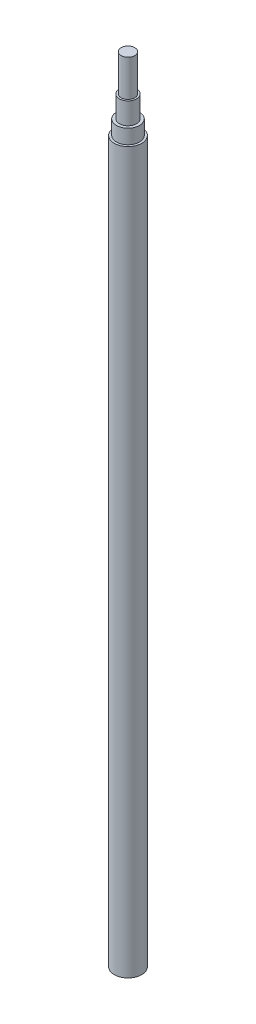
ISO-10303-21;
HEADER;
FILE_DESCRIPTION(('STEP AP214'),'2;1');
FILE_NAME('part.step','',(''),(''),'','','');
FILE_SCHEMA(('AUTOMOTIVE_DESIGN { 1 0 10303 214 1 1 1 1 }'));
ENDSEC;
DATA;
#1=APPLICATION_CONTEXT('core data for automotive mechanical design processes');
#2=APPLICATION_PROTOCOL_DEFINITION('international standard','automotive_design',2000,#1);
#3=PRODUCT_CONTEXT('',#1,'mechanical');
#4=PRODUCT('Part','Part','',(#3));
#5=PRODUCT_RELATED_PRODUCT_CATEGORY('part','',(#4));
#6=PRODUCT_DEFINITION_FORMATION('','',#4);
#7=PRODUCT_DEFINITION_CONTEXT('part definition',#1,'design');
#8=PRODUCT_DEFINITION('design','',#6,#7);
#9=PRODUCT_DEFINITION_SHAPE('','',#8);
#10=(LENGTH_UNIT() NAMED_UNIT(*) SI_UNIT(.MILLI.,.METRE.));
#11=(NAMED_UNIT(*) PLANE_ANGLE_UNIT() SI_UNIT($,.RADIAN.));
#12=(NAMED_UNIT(*) SI_UNIT($,.STERADIAN.) SOLID_ANGLE_UNIT());
#13=UNCERTAINTY_MEASURE_WITH_UNIT(LENGTH_MEASURE(1.E-05),#10,'distance_accuracy_value','');
#14=(GEOMETRIC_REPRESENTATION_CONTEXT(3) GLOBAL_UNCERTAINTY_ASSIGNED_CONTEXT((#13)) GLOBAL_UNIT_ASSIGNED_CONTEXT((#10,
#11,#12)) REPRESENTATION_CONTEXT('',''));
#15=CARTESIAN_POINT('',(0.,0.,0.));
#16=DIRECTION('',(0.,0.,1.));
#17=DIRECTION('',(1.,0.,0.));
#18=AXIS2_PLACEMENT_3D('',#15,#16,#17);
#19=CARTESIAN_POINT('',(0.,500.,0.));
#20=DIRECTION('',(0.,-1.,0.));
#21=DIRECTION('',(0.,0.,-1.));
#22=AXIS2_PLACEMENT_3D('',#19,#20,#21);
#23=CYLINDRICAL_SURFACE('',#22,9.52500000000001);
#24=CARTESIAN_POINT('',(0.,500.,0.));
#25=DIRECTION('',(0.,1.,0.));
#26=DIRECTION('',(0.,0.,1.));
#27=AXIS2_PLACEMENT_3D('',#24,#25,#26);
#28=CIRCLE('',#27,9.52500000000001);
#29=CARTESIAN_POINT('',(0.,500.,9.52500000000001));
#30=VERTEX_POINT('',#29);
#31=EDGE_CURVE('E62',#30,#30,#28,.T.);
#32=ORIENTED_EDGE('',*,*,#31,.F.);
#33=EDGE_LOOP('',(#32));
#34=FACE_BOUND('',#33,.T.);
#35=CARTESIAN_POINT('',(0.,0.,0.));
#36=DIRECTION('',(0.,1.,0.));
#37=DIRECTION('',(0.,0.,1.));
#38=AXIS2_PLACEMENT_3D('',#35,#36,#37);
#39=CIRCLE('',#38,9.52500000000001);
#40=CARTESIAN_POINT('',(0.,0.,9.52500000000001));
#41=VERTEX_POINT('',#40);
#42=EDGE_CURVE('E41',#41,#41,#39,.T.);
#43=ORIENTED_EDGE('',*,*,#42,.T.);
#44=EDGE_LOOP('',(#43));
#45=FACE_BOUND('',#44,.T.);
#46=ADVANCED_FACE('F38',(#34,#45),#23,.T.);
#47=CARTESIAN_POINT('',(0.,500.,0.));
#48=DIRECTION('',(0.,1.,0.));
#49=DIRECTION('',(0.,0.,1.));
#50=AXIS2_PLACEMENT_3D('',#47,#48,#49);
#51=PLANE('',#50);
#52=CARTESIAN_POINT('',(0.,500.,0.));
#53=DIRECTION('',(0.,1.,0.));
#54=DIRECTION('',(0.,0.,1.));
#55=AXIS2_PLACEMENT_3D('',#52,#53,#54);
#56=CIRCLE('',#55,8.);
#57=CARTESIAN_POINT('',(0.,500.,8.));
#58=VERTEX_POINT('',#57);
#59=EDGE_CURVE('E50',#58,#58,#56,.T.);
#60=ORIENTED_EDGE('',*,*,#59,.F.);
#61=EDGE_LOOP('',(#60));
#62=FACE_BOUND('',#61,.T.);
#63=ORIENTED_EDGE('',*,*,#31,.T.);
#64=EDGE_LOOP('',(#63));
#65=FACE_BOUND('',#64,.T.);
#66=ADVANCED_FACE('F73',(#62,#65),#51,.T.);
#67=CARTESIAN_POINT('',(0.,0.,0.));
#68=DIRECTION('',(0.,1.,0.));
#69=DIRECTION('',(0.,0.,1.));
#70=AXIS2_PLACEMENT_3D('',#67,#68,#69);
#71=PLANE('',#70);
#72=ORIENTED_EDGE('',*,*,#42,.F.);
#73=EDGE_LOOP('',(#72));
#74=FACE_BOUND('',#73,.T.);
#75=ADVANCED_FACE('F70',(#74),#71,.F.);
#76=CARTESIAN_POINT('',(0.,510.,0.));
#77=DIRECTION('',(0.,-1.,0.));
#78=DIRECTION('',(0.,0.,-1.));
#79=AXIS2_PLACEMENT_3D('',#76,#77,#78);
#80=CYLINDRICAL_SURFACE('',#79,8.);
#81=CARTESIAN_POINT('',(0.,510.,0.));
#82=DIRECTION('',(0.,1.,0.));
#83=DIRECTION('',(0.,0.,1.));
#84=AXIS2_PLACEMENT_3D('',#81,#82,#83);
#85=CIRCLE('',#84,8.);
#86=CARTESIAN_POINT('',(0.,510.,8.));
#87=VERTEX_POINT('',#86);
#88=EDGE_CURVE('E57',#87,#87,#85,.T.);
#89=ORIENTED_EDGE('',*,*,#88,.F.);
#90=EDGE_LOOP('',(#89));
#91=FACE_BOUND('',#90,.T.);
#92=ORIENTED_EDGE('',*,*,#59,.T.);
#93=EDGE_LOOP('',(#92));
#94=FACE_BOUND('',#93,.T.);
#95=ADVANCED_FACE('F72',(#91,#94),#80,.T.);
#96=CARTESIAN_POINT('',(0.,510.,0.));
#97=DIRECTION('',(0.,1.,0.));
#98=DIRECTION('',(0.,0.,1.));
#99=AXIS2_PLACEMENT_3D('',#96,#97,#98);
#100=PLANE('',#99);
#101=CARTESIAN_POINT('',(0.,510.,0.));
#102=DIRECTION('',(0.,1.,0.));
#103=DIRECTION('',(0.,0.,1.));
#104=AXIS2_PLACEMENT_3D('',#101,#102,#103);
#105=CIRCLE('',#104,6.);
#106=CARTESIAN_POINT('',(0.,510.,6.));
#107=VERTEX_POINT('',#106);
#108=EDGE_CURVE('E45',#107,#107,#105,.T.);
#109=ORIENTED_EDGE('',*,*,#108,.F.);
#110=EDGE_LOOP('',(#109));
#111=FACE_BOUND('',#110,.T.);
#112=ORIENTED_EDGE('',*,*,#88,.T.);
#113=EDGE_LOOP('',(#112));
#114=FACE_BOUND('',#113,.T.);
#115=ADVANCED_FACE('F78',(#111,#114),#100,.T.);
#116=CARTESIAN_POINT('',(0.,525.,0.));
#117=DIRECTION('',(0.,-1.,0.));
#118=DIRECTION('',(0.,0.,-1.));
#119=AXIS2_PLACEMENT_3D('',#116,#117,#118);
#120=CYLINDRICAL_SURFACE('',#119,6.);
#121=CARTESIAN_POINT('',(0.,525.,0.));
#122=DIRECTION('',(0.,1.,0.));
#123=DIRECTION('',(0.,0.,1.));
#124=AXIS2_PLACEMENT_3D('',#121,#122,#123);
#125=CIRCLE('',#124,6.);
#126=CARTESIAN_POINT('',(0.,525.,6.));
#127=VERTEX_POINT('',#126);
#128=EDGE_CURVE('E55',#127,#127,#125,.T.);
#129=ORIENTED_EDGE('',*,*,#128,.F.);
#130=EDGE_LOOP('',(#129));
#131=FACE_BOUND('',#130,.T.);
#132=ORIENTED_EDGE('',*,*,#108,.T.);
#133=EDGE_LOOP('',(#132));
#134=FACE_BOUND('',#133,.T.);
#135=ADVANCED_FACE('F108',(#131,#134),#120,.T.);
#136=CARTESIAN_POINT('',(0.,525.,0.));
#137=DIRECTION('',(0.,1.,0.));
#138=DIRECTION('',(0.,0.,1.));
#139=AXIS2_PLACEMENT_3D('',#136,#137,#138);
#140=PLANE('',#139);
#141=CARTESIAN_POINT('',(0.,525.,0.));
#142=DIRECTION('',(0.,1.,0.));
#143=DIRECTION('',(0.,0.,1.));
#144=AXIS2_PLACEMENT_3D('',#141,#142,#143);
#145=CIRCLE('',#144,4.7625);
#146=CARTESIAN_POINT('',(0.,525.,4.7625));
#147=VERTEX_POINT('',#146);
#148=EDGE_CURVE('E10',#147,#147,#145,.T.);
#149=ORIENTED_EDGE('',*,*,#148,.F.);
#150=EDGE_LOOP('',(#149));
#151=FACE_BOUND('',#150,.T.);
#152=ORIENTED_EDGE('',*,*,#128,.T.);
#153=EDGE_LOOP('',(#152));
#154=FACE_BOUND('',#153,.T.);
#155=ADVANCED_FACE('F118',(#151,#154),#140,.T.);
#156=CARTESIAN_POINT('',(0.,550.4,0.));
#157=DIRECTION('',(0.,-1.,0.));
#158=DIRECTION('',(0.,0.,-1.));
#159=AXIS2_PLACEMENT_3D('',#156,#157,#158);
#160=CYLINDRICAL_SURFACE('',#159,4.7625);
#161=CARTESIAN_POINT('',(0.,550.4,0.));
#162=DIRECTION('',(0.,1.,0.));
#163=DIRECTION('',(0.,0.,1.));
#164=AXIS2_PLACEMENT_3D('',#161,#162,#163);
#165=CIRCLE('',#164,4.7625);
#166=CARTESIAN_POINT('',(0.,550.4,4.7625));
#167=VERTEX_POINT('',#166);
#168=EDGE_CURVE('E54',#167,#167,#165,.T.);
#169=ORIENTED_EDGE('',*,*,#168,.F.);
#170=EDGE_LOOP('',(#169));
#171=FACE_BOUND('',#170,.T.);
#172=ORIENTED_EDGE('',*,*,#148,.T.);
#173=EDGE_LOOP('',(#172));
#174=FACE_BOUND('',#173,.T.);
#175=ADVANCED_FACE('F128',(#171,#174),#160,.T.);
#176=CARTESIAN_POINT('',(0.,550.4,0.));
#177=DIRECTION('',(0.,1.,0.));
#178=DIRECTION('',(0.,0.,1.));
#179=AXIS2_PLACEMENT_3D('',#176,#177,#178);
#180=PLANE('',#179);
#181=ORIENTED_EDGE('',*,*,#168,.T.);
#182=EDGE_LOOP('',(#181));
#183=FACE_BOUND('',#182,.T.);
#184=ADVANCED_FACE('F138',(#183),#180,.T.);
#185=CLOSED_SHELL('',(#46,#66,#75,#95,#115,#135,#155,#175,#184));
#186=MANIFOLD_SOLID_BREP('B2',#185);
#187=ADVANCED_BREP_SHAPE_REPRESENTATION('',(#18,#186),#14);
#188=SHAPE_DEFINITION_REPRESENTATION(#9,#187);
ENDSEC;
END-ISO-10303-21;
